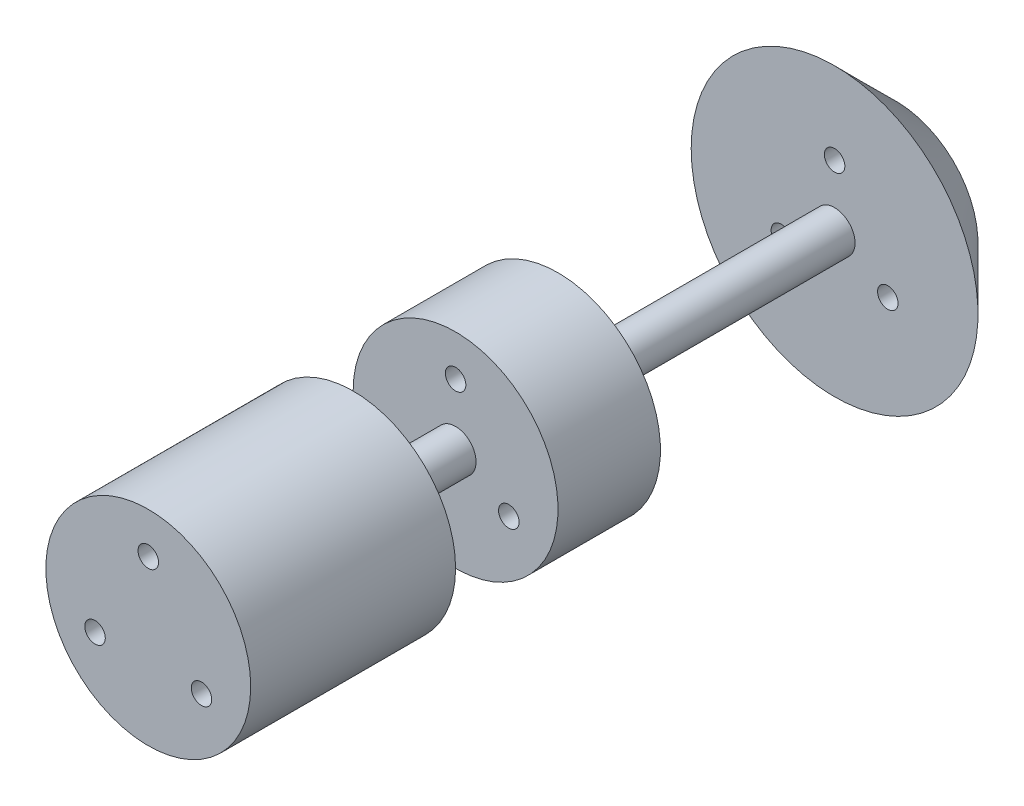
ISO-10303-21;
HEADER;
FILE_DESCRIPTION(('STEP AP214'),'2;1');
FILE_NAME('part.step','',(''),(''),'','','');
FILE_SCHEMA(('AUTOMOTIVE_DESIGN { 1 0 10303 214 1 1 1 1 }'));
ENDSEC;
DATA;
#1=APPLICATION_CONTEXT('core data for automotive mechanical design processes');
#2=APPLICATION_PROTOCOL_DEFINITION('international standard','automotive_design',2000,#1);
#3=PRODUCT_CONTEXT('',#1,'mechanical');
#4=PRODUCT('Part','Part','',(#3));
#5=PRODUCT_RELATED_PRODUCT_CATEGORY('part','',(#4));
#6=PRODUCT_DEFINITION_FORMATION('','',#4);
#7=PRODUCT_DEFINITION_CONTEXT('part definition',#1,'design');
#8=PRODUCT_DEFINITION('design','',#6,#7);
#9=PRODUCT_DEFINITION_SHAPE('','',#8);
#10=(LENGTH_UNIT() NAMED_UNIT(*) SI_UNIT(.MILLI.,.METRE.));
#11=(NAMED_UNIT(*) PLANE_ANGLE_UNIT() SI_UNIT($,.RADIAN.));
#12=(NAMED_UNIT(*) SI_UNIT($,.STERADIAN.) SOLID_ANGLE_UNIT());
#13=UNCERTAINTY_MEASURE_WITH_UNIT(LENGTH_MEASURE(1.E-05),#10,'distance_accuracy_value','');
#14=(GEOMETRIC_REPRESENTATION_CONTEXT(3) GLOBAL_UNCERTAINTY_ASSIGNED_CONTEXT((#13)) GLOBAL_UNIT_ASSIGNED_CONTEXT((#10,
#11,#12)) REPRESENTATION_CONTEXT('',''));
#15=CARTESIAN_POINT('',(0.,0.,0.));
#16=DIRECTION('',(0.,0.,1.));
#17=DIRECTION('',(1.,0.,0.));
#18=AXIS2_PLACEMENT_3D('',#15,#16,#17);
#19=CARTESIAN_POINT('',(0.,0.,9.25));
#20=DIRECTION('',(0.,0.,1.));
#21=DIRECTION('',(1.,0.,0.));
#22=AXIS2_PLACEMENT_3D('',#19,#20,#21);
#23=PLANE('',#22);
#24=CARTESIAN_POINT('',(1.29903810567655,-0.750000000000064,9.25));
#25=DIRECTION('',(0.,0.,-1.));
#26=DIRECTION('',(-1.,0.,0.));
#27=AXIS2_PLACEMENT_3D('',#24,#25,#26);
#28=CIRCLE('',#27,0.25);
#29=CARTESIAN_POINT('',(1.04903810567655,-0.750000000000064,9.25));
#30=VERTEX_POINT('',#29);
#31=EDGE_CURVE('E131',#30,#30,#28,.T.);
#32=ORIENTED_EDGE('',*,*,#31,.F.);
#33=EDGE_LOOP('',(#32));
#34=FACE_BOUND('',#33,.T.);
#35=CARTESIAN_POINT('',(-1.29903810567677,-0.749999999999935,9.25));
#36=DIRECTION('',(0.,0.,-1.));
#37=DIRECTION('',(-1.,0.,0.));
#38=AXIS2_PLACEMENT_3D('',#35,#36,#37);
#39=CIRCLE('',#38,0.25);
#40=CARTESIAN_POINT('',(-1.54903810567677,-0.749999999999935,9.25));
#41=VERTEX_POINT('',#40);
#42=EDGE_CURVE('E140',#41,#41,#39,.T.);
#43=ORIENTED_EDGE('',*,*,#42,.F.);
#44=EDGE_LOOP('',(#43));
#45=FACE_BOUND('',#44,.T.);
#46=CARTESIAN_POINT('',(0.,1.5,9.25));
#47=DIRECTION('',(0.,0.,-1.));
#48=DIRECTION('',(-1.,0.,0.));
#49=AXIS2_PLACEMENT_3D('',#46,#47,#48);
#50=CIRCLE('',#49,0.25);
#51=CARTESIAN_POINT('',(-0.25,1.5,9.25));
#52=VERTEX_POINT('',#51);
#53=EDGE_CURVE('E144',#52,#52,#50,.T.);
#54=ORIENTED_EDGE('',*,*,#53,.F.);
#55=EDGE_LOOP('',(#54));
#56=FACE_BOUND('',#55,.T.);
#57=CARTESIAN_POINT('',(0.,0.,9.25));
#58=DIRECTION('',(0.,0.,-1.));
#59=DIRECTION('',(-1.,0.,0.));
#60=AXIS2_PLACEMENT_3D('',#57,#58,#59);
#61=CIRCLE('',#60,2.00000000000014);
#62=CARTESIAN_POINT('',(-2.00000000000014,0.,9.25));
#63=VERTEX_POINT('',#62);
#64=EDGE_CURVE('E132',#63,#63,#61,.T.);
#65=ORIENTED_EDGE('',*,*,#64,.T.);
#66=EDGE_LOOP('',(#65));
#67=FACE_BOUND('',#66,.T.);
#68=ADVANCED_FACE('F42',(#34,#45,#56,#67),#23,.F.);
#69=CARTESIAN_POINT('',(0.,0.,9.25));
#70=DIRECTION('',(0.,0.,1.));
#71=DIRECTION('',(1.,0.,0.));
#72=AXIS2_PLACEMENT_3D('',#69,#70,#71);
#73=CYLINDRICAL_SURFACE('',#72,0.5);
#74=CARTESIAN_POINT('',(0.,0.,20.));
#75=DIRECTION('',(0.,0.,1.));
#76=DIRECTION('',(1.,0.,0.));
#77=AXIS2_PLACEMENT_3D('',#74,#75,#76);
#78=CIRCLE('',#77,0.5);
#79=CARTESIAN_POINT('',(0.5,0.,20.));
#80=VERTEX_POINT('',#79);
#81=EDGE_CURVE('E10',#80,#80,#78,.F.);
#82=ORIENTED_EDGE('',*,*,#81,.F.);
#83=EDGE_LOOP('',(#82));
#84=FACE_BOUND('',#83,.T.);
#85=CARTESIAN_POINT('',(0.,0.,22.5));
#86=DIRECTION('',(0.,0.,1.));
#87=DIRECTION('',(1.,0.,0.));
#88=AXIS2_PLACEMENT_3D('',#85,#86,#87);
#89=CIRCLE('',#88,0.5);
#90=CARTESIAN_POINT('',(0.5,0.,22.5));
#91=VERTEX_POINT('',#90);
#92=EDGE_CURVE('E46',#91,#91,#89,.F.);
#93=ORIENTED_EDGE('',*,*,#92,.T.);
#94=EDGE_LOOP('',(#93));
#95=FACE_BOUND('',#94,.T.);
#96=ADVANCED_FACE('F174',(#84,#95),#73,.T.);
#97=CARTESIAN_POINT('',(0.,0.,10.75));
#98=DIRECTION('',(0.,0.,1.));
#99=DIRECTION('',(1.,0.,0.));
#100=AXIS2_PLACEMENT_3D('',#97,#98,#99);
#101=CIRCLE('',#100,0.5);
#102=CARTESIAN_POINT('',(0.5,0.,10.75));
#103=VERTEX_POINT('',#102);
#104=EDGE_CURVE('E51',#103,#103,#101,.T.);
#105=ORIENTED_EDGE('',*,*,#104,.T.);
#106=EDGE_LOOP('',(#105));
#107=FACE_BOUND('',#106,.T.);
#108=CARTESIAN_POINT('',(0.,0.,17.5));
#109=DIRECTION('',(0.,0.,1.));
#110=DIRECTION('',(1.,0.,0.));
#111=AXIS2_PLACEMENT_3D('',#108,#109,#110);
#112=CIRCLE('',#111,0.5);
#113=CARTESIAN_POINT('',(0.5,0.,17.5));
#114=VERTEX_POINT('',#113);
#115=EDGE_CURVE('E56',#114,#114,#112,.F.);
#116=ORIENTED_EDGE('',*,*,#115,.T.);
#117=EDGE_LOOP('',(#116));
#118=FACE_BOUND('',#117,.T.);
#119=ADVANCED_FACE('F163',(#107,#118),#73,.T.);
#120=CARTESIAN_POINT('',(0.,0.,10.75));
#121=DIRECTION('',(0.,0.,1.));
#122=DIRECTION('',(1.,0.,0.));
#123=AXIS2_PLACEMENT_3D('',#120,#121,#122);
#124=PLANE('',#123);
#125=CARTESIAN_POINT('',(0.,1.5,10.75));
#126=DIRECTION('',(0.,0.,1.));
#127=DIRECTION('',(1.,0.,0.));
#128=AXIS2_PLACEMENT_3D('',#125,#126,#127);
#129=CIRCLE('',#128,0.25);
#130=CARTESIAN_POINT('',(0.25,1.5,10.75));
#131=VERTEX_POINT('',#130);
#132=EDGE_CURVE('E75',#131,#131,#129,.T.);
#133=ORIENTED_EDGE('',*,*,#132,.F.);
#134=EDGE_LOOP('',(#133));
#135=FACE_BOUND('',#134,.T.);
#136=CARTESIAN_POINT('',(-1.29903810567677,-0.749999999999935,10.75));
#137=DIRECTION('',(0.,0.,1.));
#138=DIRECTION('',(1.,0.,0.));
#139=AXIS2_PLACEMENT_3D('',#136,#137,#138);
#140=CIRCLE('',#139,0.25);
#141=CARTESIAN_POINT('',(-1.04903810567677,-0.749999999999935,10.75));
#142=VERTEX_POINT('',#141);
#143=EDGE_CURVE('E94',#142,#142,#140,.T.);
#144=ORIENTED_EDGE('',*,*,#143,.F.);
#145=EDGE_LOOP('',(#144));
#146=FACE_BOUND('',#145,.T.);
#147=CARTESIAN_POINT('',(1.29903810567655,-0.750000000000064,10.75));
#148=DIRECTION('',(0.,0.,1.));
#149=DIRECTION('',(1.,0.,0.));
#150=AXIS2_PLACEMENT_3D('',#147,#148,#149);
#151=CIRCLE('',#150,0.25);
#152=CARTESIAN_POINT('',(1.54903810567655,-0.750000000000064,10.75));
#153=VERTEX_POINT('',#152);
#154=EDGE_CURVE('E110',#153,#153,#151,.T.);
#155=ORIENTED_EDGE('',*,*,#154,.F.);
#156=EDGE_LOOP('',(#155));
#157=FACE_BOUND('',#156,.T.);
#158=ORIENTED_EDGE('',*,*,#104,.F.);
#159=EDGE_LOOP('',(#158));
#160=FACE_BOUND('',#159,.T.);
#161=CARTESIAN_POINT('',(0.,0.,10.75));
#162=DIRECTION('',(0.,0.,-1.));
#163=DIRECTION('',(-1.,0.,0.));
#164=AXIS2_PLACEMENT_3D('',#161,#162,#163);
#165=CIRCLE('',#164,3.50000000000012);
#166=CARTESIAN_POINT('',(-3.50000000000012,0.,10.75));
#167=VERTEX_POINT('',#166);
#168=EDGE_CURVE('E154',#167,#167,#165,.T.);
#169=ORIENTED_EDGE('',*,*,#168,.F.);
#170=EDGE_LOOP('',(#169));
#171=FACE_BOUND('',#170,.T.);
#172=ADVANCED_FACE('F44',(#135,#146,#157,#160,#171),#124,.T.);
#173=CARTESIAN_POINT('',(0.,0.,20.));
#174=DIRECTION('',(0.,0.,-1.));
#175=DIRECTION('',(-1.,0.,0.));
#176=AXIS2_PLACEMENT_3D('',#173,#174,#175);
#177=CYLINDRICAL_SURFACE('',#176,2.49999999999988);
#178=CARTESIAN_POINT('',(0.,0.,20.));
#179=DIRECTION('',(0.,0.,1.));
#180=DIRECTION('',(1.,0.,0.));
#181=AXIS2_PLACEMENT_3D('',#178,#179,#180);
#182=CIRCLE('',#181,2.49999999999988);
#183=CARTESIAN_POINT('',(-2.49999999999988,0.,20.));
#184=VERTEX_POINT('',#183);
#185=EDGE_CURVE('E61',#184,#184,#182,.T.);
#186=CARTESIAN_POINT('',(0.,0.,17.5));
#187=DIRECTION('',(0.,0.,1.));
#188=DIRECTION('',(1.,0.,0.));
#189=AXIS2_PLACEMENT_3D('',#186,#187,#188);
#190=CIRCLE('',#189,2.49999999999988);
#191=CARTESIAN_POINT('',(-2.49999999999988,0.,17.5));
#192=VERTEX_POINT('',#191);
#193=EDGE_CURVE('E66',#192,#192,#190,.T.);
#194=CARTESIAN_POINT('',(-2.49999999999988,0.,20.));
#195=CARTESIAN_POINT('',(-2.49999999999988,0.,19.9739583333333));
#196=CARTESIAN_POINT('',(-2.49999999999988,0.,19.9479166666667));
#197=CARTESIAN_POINT('',(-2.49999999999988,0.,19.8958333333333));
#198=CARTESIAN_POINT('',(-2.49999999999988,0.,19.8697916666667));
#199=CARTESIAN_POINT('',(-2.49999999999988,0.,19.8177083333333));
#200=CARTESIAN_POINT('',(-2.49999999999988,0.,19.7916666666667));
#201=CARTESIAN_POINT('',(-2.49999999999988,0.,19.7395833333333));
#202=CARTESIAN_POINT('',(-2.49999999999988,0.,19.7135416666667));
#203=CARTESIAN_POINT('',(-2.49999999999988,0.,19.6614583333333));
#204=CARTESIAN_POINT('',(-2.49999999999988,0.,19.6354166666667));
#205=CARTESIAN_POINT('',(-2.49999999999988,0.,19.5833333333333));
#206=CARTESIAN_POINT('',(-2.49999999999988,0.,19.5572916666667));
#207=CARTESIAN_POINT('',(-2.49999999999988,0.,19.5052083333333));
#208=CARTESIAN_POINT('',(-2.49999999999988,0.,19.4791666666667));
#209=CARTESIAN_POINT('',(-2.49999999999988,0.,19.4270833333333));
#210=CARTESIAN_POINT('',(-2.49999999999988,0.,19.4010416666667));
#211=CARTESIAN_POINT('',(-2.49999999999988,0.,19.3489583333333));
#212=CARTESIAN_POINT('',(-2.49999999999988,0.,19.3229166666667));
#213=CARTESIAN_POINT('',(-2.49999999999988,0.,19.2708333333333));
#214=CARTESIAN_POINT('',(-2.49999999999988,0.,19.2447916666667));
#215=CARTESIAN_POINT('',(-2.49999999999988,0.,19.1927083333333));
#216=CARTESIAN_POINT('',(-2.49999999999988,0.,19.1666666666667));
#217=CARTESIAN_POINT('',(-2.49999999999988,0.,19.1145833333333));
#218=CARTESIAN_POINT('',(-2.49999999999988,0.,19.0885416666667));
#219=CARTESIAN_POINT('',(-2.49999999999988,0.,19.0364583333333));
#220=CARTESIAN_POINT('',(-2.49999999999988,0.,19.0104166666667));
#221=CARTESIAN_POINT('',(-2.49999999999988,0.,18.9583333333333));
#222=CARTESIAN_POINT('',(-2.49999999999988,0.,18.9322916666667));
#223=CARTESIAN_POINT('',(-2.49999999999988,0.,18.8802083333333));
#224=CARTESIAN_POINT('',(-2.49999999999988,0.,18.8541666666667));
#225=CARTESIAN_POINT('',(-2.49999999999988,0.,18.8020833333333));
#226=CARTESIAN_POINT('',(-2.49999999999988,0.,18.7760416666667));
#227=CARTESIAN_POINT('',(-2.49999999999988,0.,18.7239583333333));
#228=CARTESIAN_POINT('',(-2.49999999999988,0.,18.6979166666667));
#229=CARTESIAN_POINT('',(-2.49999999999988,0.,18.6458333333333));
#230=CARTESIAN_POINT('',(-2.49999999999988,0.,18.6197916666667));
#231=CARTESIAN_POINT('',(-2.49999999999988,0.,18.5677083333333));
#232=CARTESIAN_POINT('',(-2.49999999999988,0.,18.5416666666667));
#233=CARTESIAN_POINT('',(-2.49999999999988,0.,18.4895833333333));
#234=CARTESIAN_POINT('',(-2.49999999999988,0.,18.4635416666667));
#235=CARTESIAN_POINT('',(-2.49999999999988,0.,18.4114583333333));
#236=CARTESIAN_POINT('',(-2.49999999999988,0.,18.3854166666667));
#237=CARTESIAN_POINT('',(-2.49999999999988,0.,18.3333333333333));
#238=CARTESIAN_POINT('',(-2.49999999999988,0.,18.3072916666667));
#239=CARTESIAN_POINT('',(-2.49999999999988,0.,18.2552083333333));
#240=CARTESIAN_POINT('',(-2.49999999999988,0.,18.2291666666667));
#241=CARTESIAN_POINT('',(-2.49999999999988,0.,18.1770833333333));
#242=CARTESIAN_POINT('',(-2.49999999999988,0.,18.1510416666667));
#243=CARTESIAN_POINT('',(-2.49999999999988,0.,18.0989583333333));
#244=CARTESIAN_POINT('',(-2.49999999999988,0.,18.0729166666667));
#245=CARTESIAN_POINT('',(-2.49999999999988,0.,18.0208333333333));
#246=CARTESIAN_POINT('',(-2.49999999999988,0.,17.9947916666667));
#247=CARTESIAN_POINT('',(-2.49999999999988,0.,17.9427083333333));
#248=CARTESIAN_POINT('',(-2.49999999999988,0.,17.9166666666667));
#249=CARTESIAN_POINT('',(-2.49999999999988,0.,17.8645833333333));
#250=CARTESIAN_POINT('',(-2.49999999999988,0.,17.8385416666667));
#251=CARTESIAN_POINT('',(-2.49999999999988,0.,17.7864583333333));
#252=CARTESIAN_POINT('',(-2.49999999999988,0.,17.7604166666667));
#253=CARTESIAN_POINT('',(-2.49999999999988,0.,17.7083333333333));
#254=CARTESIAN_POINT('',(-2.49999999999988,0.,17.6822916666667));
#255=CARTESIAN_POINT('',(-2.49999999999988,0.,17.6302083333333));
#256=CARTESIAN_POINT('',(-2.49999999999988,0.,17.6041666666667));
#257=CARTESIAN_POINT('',(-2.49999999999988,0.,17.5520833333333));
#258=CARTESIAN_POINT('',(-2.49999999999988,0.,17.5260416666667));
#259=CARTESIAN_POINT('',(-2.49999999999988,0.,17.5));
#260=B_SPLINE_CURVE_WITH_KNOTS('',3,(#194,#195,#196,#197,#198,#199,#200,#201,#202,#203,#204,
#205,#206,#207,#208,#209,#210,#211,#212,#213,#214,#215,#216,#217,#218,#219,#220,#221,#222,#223,
#224,#225,#226,#227,#228,#229,#230,#231,#232,#233,#234,#235,#236,#237,#238,#239,#240,#241,#242,
#243,#244,#245,#246,#247,#248,#249,#250,#251,#252,#253,#254,#255,#256,#257,#258,#259),
.UNSPECIFIED.,.F.,.F.,(4,2,2,2,2,2,2,2,2,2,2,2,2,2,2,2,2,2,2,2,2,2,2,2,2,2,2,2,2,2,2,2,4),(0.,
0.0781250000000018,0.15625,0.234375000000002,0.3125,0.390625000000002,0.46875,0.546875000000002,
0.625000000000001,0.703125000000002,0.781250000000001,0.859375000000002,0.937500000000001,
1.015625,1.09375,1.171875,1.25,1.328125,1.40625,1.484375,1.5625,1.640625,1.71875,1.796875,1.875,
1.953125,2.03125,2.109375,2.1875,2.265625,2.34375,2.421875,2.5),.UNSPECIFIED.);
#261=EDGE_CURVE('BSEAM162',#184,#192,#260,.T.);
#262=ORIENTED_EDGE('',*,*,#185,.F.);
#263=ORIENTED_EDGE('',*,*,#193,.T.);
#264=ORIENTED_EDGE('',*,*,#261,.T.);
#265=ORIENTED_EDGE('',*,*,#261,.F.);
#266=EDGE_LOOP('',(#262,#264,#263,#265));
#267=FACE_BOUND('',#266,.T.);
#268=ADVANCED_FACE('F162',(#267),#177,.T.);
#269=CARTESIAN_POINT('',(0.,0.,20.));
#270=DIRECTION('',(0.,0.,1.));
#271=DIRECTION('',(1.,0.,0.));
#272=AXIS2_PLACEMENT_3D('',#269,#270,#271);
#273=PLANE('',#272);
#274=CARTESIAN_POINT('',(0.,1.5,20.));
#275=DIRECTION('',(0.,0.,1.));
#276=DIRECTION('',(1.,0.,0.));
#277=AXIS2_PLACEMENT_3D('',#274,#275,#276);
#278=CIRCLE('',#277,0.25);
#279=CARTESIAN_POINT('',(0.25,1.5,20.));
#280=VERTEX_POINT('',#279);
#281=EDGE_CURVE('E82',#280,#280,#278,.T.);
#282=ORIENTED_EDGE('',*,*,#281,.F.);
#283=EDGE_LOOP('',(#282));
#284=FACE_BOUND('',#283,.T.);
#285=CARTESIAN_POINT('',(-1.29903810567677,-0.749999999999935,20.));
#286=DIRECTION('',(0.,0.,1.));
#287=DIRECTION('',(1.,0.,0.));
#288=AXIS2_PLACEMENT_3D('',#285,#286,#287);
#289=CIRCLE('',#288,0.25);
#290=CARTESIAN_POINT('',(-1.04903810567677,-0.749999999999935,20.));
#291=VERTEX_POINT('',#290);
#292=EDGE_CURVE('E98',#291,#291,#289,.T.);
#293=ORIENTED_EDGE('',*,*,#292,.F.);
#294=EDGE_LOOP('',(#293));
#295=FACE_BOUND('',#294,.T.);
#296=CARTESIAN_POINT('',(1.29903810567655,-0.750000000000064,20.));
#297=DIRECTION('',(0.,0.,1.));
#298=DIRECTION('',(1.,0.,0.));
#299=AXIS2_PLACEMENT_3D('',#296,#297,#298);
#300=CIRCLE('',#299,0.25);
#301=CARTESIAN_POINT('',(1.54903810567655,-0.750000000000064,20.));
#302=VERTEX_POINT('',#301);
#303=EDGE_CURVE('E114',#302,#302,#300,.T.);
#304=ORIENTED_EDGE('',*,*,#303,.F.);
#305=EDGE_LOOP('',(#304));
#306=FACE_BOUND('',#305,.T.);
#307=ORIENTED_EDGE('',*,*,#81,.T.);
#308=EDGE_LOOP('',(#307));
#309=FACE_BOUND('',#308,.T.);
#310=ORIENTED_EDGE('',*,*,#185,.T.);
#311=EDGE_LOOP('',(#310));
#312=FACE_BOUND('',#311,.T.);
#313=ADVANCED_FACE('F170',(#284,#295,#306,#309,#312),#273,.T.);
#314=CARTESIAN_POINT('',(0.,0.,17.5));
#315=DIRECTION('',(0.,0.,1.));
#316=DIRECTION('',(1.,0.,0.));
#317=AXIS2_PLACEMENT_3D('',#314,#315,#316);
#318=PLANE('',#317);
#319=CARTESIAN_POINT('',(0.,1.5,17.5));
#320=DIRECTION('',(0.,0.,1.));
#321=DIRECTION('',(1.,0.,0.));
#322=AXIS2_PLACEMENT_3D('',#319,#320,#321);
#323=CIRCLE('',#322,0.25);
#324=CARTESIAN_POINT('',(0.25,1.5,17.5));
#325=VERTEX_POINT('',#324);
#326=EDGE_CURVE('E86',#325,#325,#323,.T.);
#327=ORIENTED_EDGE('',*,*,#326,.T.);
#328=EDGE_LOOP('',(#327));
#329=FACE_BOUND('',#328,.T.);
#330=CARTESIAN_POINT('',(-1.29903810567677,-0.749999999999935,17.5));
#331=DIRECTION('',(0.,0.,1.));
#332=DIRECTION('',(1.,0.,0.));
#333=AXIS2_PLACEMENT_3D('',#330,#331,#332);
#334=CIRCLE('',#333,0.25);
#335=CARTESIAN_POINT('',(-1.04903810567677,-0.749999999999935,17.5));
#336=VERTEX_POINT('',#335);
#337=EDGE_CURVE('E102',#336,#336,#334,.T.);
#338=ORIENTED_EDGE('',*,*,#337,.T.);
#339=EDGE_LOOP('',(#338));
#340=FACE_BOUND('',#339,.T.);
#341=CARTESIAN_POINT('',(1.29903810567655,-0.750000000000064,17.5));
#342=DIRECTION('',(0.,0.,1.));
#343=DIRECTION('',(1.,0.,0.));
#344=AXIS2_PLACEMENT_3D('',#341,#342,#343);
#345=CIRCLE('',#344,0.25);
#346=CARTESIAN_POINT('',(1.54903810567655,-0.750000000000064,17.5));
#347=VERTEX_POINT('',#346);
#348=EDGE_CURVE('E118',#347,#347,#345,.T.);
#349=ORIENTED_EDGE('',*,*,#348,.T.);
#350=EDGE_LOOP('',(#349));
#351=FACE_BOUND('',#350,.T.);
#352=ORIENTED_EDGE('',*,*,#115,.F.);
#353=EDGE_LOOP('',(#352));
#354=FACE_BOUND('',#353,.T.);
#355=ORIENTED_EDGE('',*,*,#193,.F.);
#356=EDGE_LOOP('',(#355));
#357=FACE_BOUND('',#356,.T.);
#358=ADVANCED_FACE('F197',(#329,#340,#351,#354,#357),#318,.F.);
#359=CARTESIAN_POINT('',(-1.22460635382238E-13,0.,27.5));
#360=DIRECTION('',(0.,0.,-1.));
#361=DIRECTION('',(-1.,0.,0.));
#362=AXIS2_PLACEMENT_3D('',#359,#360,#361);
#363=CYLINDRICAL_SURFACE('',#362,2.5);
#364=CARTESIAN_POINT('',(-1.22460635382238E-13,0.,27.5));
#365=DIRECTION('',(0.,0.,1.));
#366=DIRECTION('',(1.,0.,0.));
#367=AXIS2_PLACEMENT_3D('',#364,#365,#366);
#368=CIRCLE('',#367,2.5);
#369=CARTESIAN_POINT('',(2.49999999999988,0.,27.5));
#370=VERTEX_POINT('',#369);
#371=EDGE_CURVE('E74',#370,#370,#368,.T.);
#372=ORIENTED_EDGE('',*,*,#371,.F.);
#373=EDGE_LOOP('',(#372));
#374=FACE_BOUND('',#373,.T.);
#375=CARTESIAN_POINT('',(-1.22460635382238E-13,0.,22.5));
#376=DIRECTION('',(0.,0.,1.));
#377=DIRECTION('',(1.,0.,0.));
#378=AXIS2_PLACEMENT_3D('',#375,#376,#377);
#379=CIRCLE('',#378,2.5);
#380=CARTESIAN_POINT('',(2.49999999999988,0.,22.5));
#381=VERTEX_POINT('',#380);
#382=EDGE_CURVE('E70',#381,#381,#379,.T.);
#383=ORIENTED_EDGE('',*,*,#382,.T.);
#384=EDGE_LOOP('',(#383));
#385=FACE_BOUND('',#384,.T.);
#386=ADVANCED_FACE('F201',(#374,#385),#363,.T.);
#387=CARTESIAN_POINT('',(-1.22460635382238E-13,0.,22.5));
#388=DIRECTION('',(0.,0.,1.));
#389=DIRECTION('',(1.,0.,0.));
#390=AXIS2_PLACEMENT_3D('',#387,#388,#389);
#391=PLANE('',#390);
#392=CARTESIAN_POINT('',(0.,1.5,22.5));
#393=DIRECTION('',(0.,0.,1.));
#394=DIRECTION('',(1.,0.,0.));
#395=AXIS2_PLACEMENT_3D('',#392,#393,#394);
#396=CIRCLE('',#395,0.25);
#397=CARTESIAN_POINT('',(0.25,1.5,22.5));
#398=VERTEX_POINT('',#397);
#399=EDGE_CURVE('E90',#398,#398,#396,.T.);
#400=ORIENTED_EDGE('',*,*,#399,.T.);
#401=EDGE_LOOP('',(#400));
#402=FACE_BOUND('',#401,.T.);
#403=CARTESIAN_POINT('',(-1.29903810567677,-0.749999999999935,22.5));
#404=DIRECTION('',(0.,0.,1.));
#405=DIRECTION('',(1.,0.,0.));
#406=AXIS2_PLACEMENT_3D('',#403,#404,#405);
#407=CIRCLE('',#406,0.25);
#408=CARTESIAN_POINT('',(-1.04903810567677,-0.749999999999935,22.5));
#409=VERTEX_POINT('',#408);
#410=EDGE_CURVE('E106',#409,#409,#407,.T.);
#411=ORIENTED_EDGE('',*,*,#410,.T.);
#412=EDGE_LOOP('',(#411));
#413=FACE_BOUND('',#412,.T.);
#414=CARTESIAN_POINT('',(1.29903810567655,-0.750000000000064,22.5));
#415=DIRECTION('',(0.,0.,1.));
#416=DIRECTION('',(1.,0.,0.));
#417=AXIS2_PLACEMENT_3D('',#414,#415,#416);
#418=CIRCLE('',#417,0.25);
#419=CARTESIAN_POINT('',(1.54903810567655,-0.750000000000064,22.5));
#420=VERTEX_POINT('',#419);
#421=EDGE_CURVE('E122',#420,#420,#418,.T.);
#422=ORIENTED_EDGE('',*,*,#421,.T.);
#423=EDGE_LOOP('',(#422));
#424=FACE_BOUND('',#423,.T.);
#425=ORIENTED_EDGE('',*,*,#92,.F.);
#426=EDGE_LOOP('',(#425));
#427=FACE_BOUND('',#426,.T.);
#428=ORIENTED_EDGE('',*,*,#382,.F.);
#429=EDGE_LOOP('',(#428));
#430=FACE_BOUND('',#429,.T.);
#431=ADVANCED_FACE('F193',(#402,#413,#424,#427,#430),#391,.F.);
#432=CARTESIAN_POINT('',(0.,0.,27.5));
#433=DIRECTION('',(0.,0.,1.));
#434=DIRECTION('',(1.,0.,0.));
#435=AXIS2_PLACEMENT_3D('',#432,#433,#434);
#436=PLANE('',#435);
#437=CARTESIAN_POINT('',(0.,1.5,27.5));
#438=DIRECTION('',(0.,0.,-1.));
#439=DIRECTION('',(-1.,0.,0.));
#440=AXIS2_PLACEMENT_3D('',#437,#438,#439);
#441=CIRCLE('',#440,0.25);
#442=CARTESIAN_POINT('',(-0.25,1.5,27.5));
#443=VERTEX_POINT('',#442);
#444=EDGE_CURVE('E126',#443,#443,#441,.T.);
#445=ORIENTED_EDGE('',*,*,#444,.T.);
#446=EDGE_LOOP('',(#445));
#447=FACE_BOUND('',#446,.T.);
#448=CARTESIAN_POINT('',(-1.29903810567677,-0.749999999999935,27.5));
#449=DIRECTION('',(0.,0.,-1.));
#450=DIRECTION('',(-1.,0.,0.));
#451=AXIS2_PLACEMENT_3D('',#448,#449,#450);
#452=CIRCLE('',#451,0.25);
#453=CARTESIAN_POINT('',(-1.54903810567677,-0.749999999999935,27.5));
#454=VERTEX_POINT('',#453);
#455=EDGE_CURVE('E136',#454,#454,#452,.T.);
#456=ORIENTED_EDGE('',*,*,#455,.T.);
#457=EDGE_LOOP('',(#456));
#458=FACE_BOUND('',#457,.T.);
#459=CARTESIAN_POINT('',(1.29903810567655,-0.750000000000064,27.5));
#460=DIRECTION('',(0.,0.,-1.));
#461=DIRECTION('',(-1.,0.,0.));
#462=AXIS2_PLACEMENT_3D('',#459,#460,#461);
#463=CIRCLE('',#462,0.25);
#464=CARTESIAN_POINT('',(1.04903810567655,-0.750000000000064,27.5));
#465=VERTEX_POINT('',#464);
#466=EDGE_CURVE('E127',#465,#465,#463,.T.);
#467=ORIENTED_EDGE('',*,*,#466,.T.);
#468=EDGE_LOOP('',(#467));
#469=FACE_BOUND('',#468,.T.);
#470=ORIENTED_EDGE('',*,*,#371,.T.);
#471=EDGE_LOOP('',(#470));
#472=FACE_BOUND('',#471,.T.);
#473=ADVANCED_FACE('F190',(#447,#458,#469,#472),#436,.T.);
#474=CARTESIAN_POINT('',(1.29903810567655,-0.750000000000064,27.5));
#475=DIRECTION('',(0.,0.,-1.));
#476=DIRECTION('',(-1.,0.,0.));
#477=AXIS2_PLACEMENT_3D('',#474,#475,#476);
#478=CYLINDRICAL_SURFACE('',#477,0.25);
#479=ORIENTED_EDGE('',*,*,#466,.F.);
#480=EDGE_LOOP('',(#479));
#481=FACE_BOUND('',#480,.T.);
#482=ORIENTED_EDGE('',*,*,#421,.F.);
#483=EDGE_LOOP('',(#482));
#484=FACE_BOUND('',#483,.T.);
#485=ADVANCED_FACE('F192',(#481,#484),#478,.F.);
#486=CARTESIAN_POINT('',(-1.29903810567677,-0.749999999999935,27.5));
#487=DIRECTION('',(0.,0.,-1.));
#488=DIRECTION('',(-1.,0.,0.));
#489=AXIS2_PLACEMENT_3D('',#486,#487,#488);
#490=CYLINDRICAL_SURFACE('',#489,0.25);
#491=ORIENTED_EDGE('',*,*,#455,.F.);
#492=EDGE_LOOP('',(#491));
#493=FACE_BOUND('',#492,.T.);
#494=ORIENTED_EDGE('',*,*,#410,.F.);
#495=EDGE_LOOP('',(#494));
#496=FACE_BOUND('',#495,.T.);
#497=ADVANCED_FACE('F221',(#493,#496),#490,.F.);
#498=CARTESIAN_POINT('',(0.,1.5,27.5));
#499=DIRECTION('',(0.,0.,-1.));
#500=DIRECTION('',(-1.,0.,0.));
#501=AXIS2_PLACEMENT_3D('',#498,#499,#500);
#502=CYLINDRICAL_SURFACE('',#501,0.25);
#503=ORIENTED_EDGE('',*,*,#444,.F.);
#504=EDGE_LOOP('',(#503));
#505=FACE_BOUND('',#504,.T.);
#506=ORIENTED_EDGE('',*,*,#399,.F.);
#507=EDGE_LOOP('',(#506));
#508=FACE_BOUND('',#507,.T.);
#509=ADVANCED_FACE('F224',(#505,#508),#502,.F.);
#510=ORIENTED_EDGE('',*,*,#303,.T.);
#511=EDGE_LOOP('',(#510));
#512=FACE_BOUND('',#511,.T.);
#513=ORIENTED_EDGE('',*,*,#348,.F.);
#514=EDGE_LOOP('',(#513));
#515=FACE_BOUND('',#514,.T.);
#516=ADVANCED_FACE('F215',(#512,#515),#478,.F.);
#517=ORIENTED_EDGE('',*,*,#292,.T.);
#518=EDGE_LOOP('',(#517));
#519=FACE_BOUND('',#518,.T.);
#520=ORIENTED_EDGE('',*,*,#337,.F.);
#521=EDGE_LOOP('',(#520));
#522=FACE_BOUND('',#521,.T.);
#523=ADVANCED_FACE('F220',(#519,#522),#490,.F.);
#524=ORIENTED_EDGE('',*,*,#281,.T.);
#525=EDGE_LOOP('',(#524));
#526=FACE_BOUND('',#525,.T.);
#527=ORIENTED_EDGE('',*,*,#326,.F.);
#528=EDGE_LOOP('',(#527));
#529=FACE_BOUND('',#528,.T.);
#530=ADVANCED_FACE('F213',(#526,#529),#502,.F.);
#531=ORIENTED_EDGE('',*,*,#154,.T.);
#532=EDGE_LOOP('',(#531));
#533=FACE_BOUND('',#532,.T.);
#534=ORIENTED_EDGE('',*,*,#31,.T.);
#535=EDGE_LOOP('',(#534));
#536=FACE_BOUND('',#535,.T.);
#537=ADVANCED_FACE('F209',(#533,#536),#478,.F.);
#538=ORIENTED_EDGE('',*,*,#143,.T.);
#539=EDGE_LOOP('',(#538));
#540=FACE_BOUND('',#539,.T.);
#541=ORIENTED_EDGE('',*,*,#42,.T.);
#542=EDGE_LOOP('',(#541));
#543=FACE_BOUND('',#542,.T.);
#544=ADVANCED_FACE('F212',(#540,#543),#490,.F.);
#545=ORIENTED_EDGE('',*,*,#132,.T.);
#546=EDGE_LOOP('',(#545));
#547=FACE_BOUND('',#546,.T.);
#548=ORIENTED_EDGE('',*,*,#53,.T.);
#549=EDGE_LOOP('',(#548));
#550=FACE_BOUND('',#549,.T.);
#551=ADVANCED_FACE('F218',(#547,#550),#502,.F.);
#552=CARTESIAN_POINT('',(0.,0.,10.75));
#553=DIRECTION('',(0.,0.,1.));
#554=DIRECTION('',(1.,0.,0.));
#555=AXIS2_PLACEMENT_3D('',#552,#553,#554);
#556=CONICAL_SURFACE('',#555,3.50000000000012,0.785398163397443);
#557=ORIENTED_EDGE('',*,*,#64,.F.);
#558=EDGE_LOOP('',(#557));
#559=FACE_BOUND('',#558,.T.);
#560=ORIENTED_EDGE('',*,*,#168,.T.);
#561=EDGE_LOOP('',(#560));
#562=FACE_BOUND('',#561,.T.);
#563=ADVANCED_FACE('F159',(#559,#562),#556,.T.);
#564=CLOSED_SHELL('',(#68,#96,#119,#172,#268,#313,#358,#386,#431,#473,#485,#497,#509,#516,#523,
#530,#537,#544,#551,#563));
#565=MANIFOLD_SOLID_BREP('B2',#564);
#566=ADVANCED_BREP_SHAPE_REPRESENTATION('',(#18,#565),#14);
#567=SHAPE_DEFINITION_REPRESENTATION(#9,#566);
ENDSEC;
END-ISO-10303-21;
